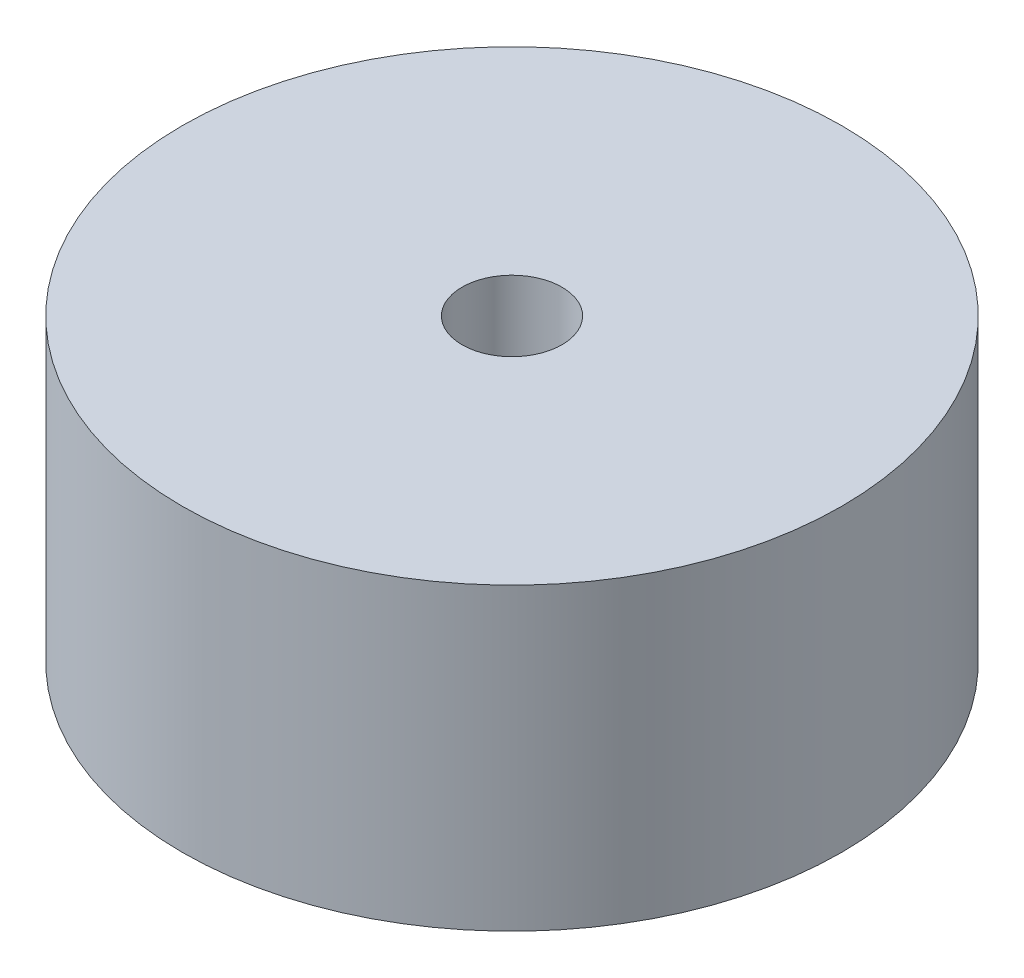
ISO-10303-21;
HEADER;
FILE_DESCRIPTION(('STEP AP214'),'2;1');
FILE_NAME('part.step','',(''),(''),'','','');
FILE_SCHEMA(('AUTOMOTIVE_DESIGN { 1 0 10303 214 1 1 1 1 }'));
ENDSEC;
DATA;
#1=APPLICATION_CONTEXT('core data for automotive mechanical design processes');
#2=APPLICATION_PROTOCOL_DEFINITION('international standard','automotive_design',2000,#1);
#3=PRODUCT_CONTEXT('',#1,'mechanical');
#4=PRODUCT('Part','Part','',(#3));
#5=PRODUCT_RELATED_PRODUCT_CATEGORY('part','',(#4));
#6=PRODUCT_DEFINITION_FORMATION('','',#4);
#7=PRODUCT_DEFINITION_CONTEXT('part definition',#1,'design');
#8=PRODUCT_DEFINITION('design','',#6,#7);
#9=PRODUCT_DEFINITION_SHAPE('','',#8);
#10=(LENGTH_UNIT() NAMED_UNIT(*) SI_UNIT(.MILLI.,.METRE.));
#11=(NAMED_UNIT(*) PLANE_ANGLE_UNIT() SI_UNIT($,.RADIAN.));
#12=(NAMED_UNIT(*) SI_UNIT($,.STERADIAN.) SOLID_ANGLE_UNIT());
#13=UNCERTAINTY_MEASURE_WITH_UNIT(LENGTH_MEASURE(1.E-05),#10,'distance_accuracy_value','');
#14=(GEOMETRIC_REPRESENTATION_CONTEXT(3) GLOBAL_UNCERTAINTY_ASSIGNED_CONTEXT((#13)) GLOBAL_UNIT_ASSIGNED_CONTEXT((#10,
#11,#12)) REPRESENTATION_CONTEXT('',''));
#15=CARTESIAN_POINT('',(0.,0.,0.));
#16=DIRECTION('',(0.,0.,1.));
#17=DIRECTION('',(1.,0.,0.));
#18=AXIS2_PLACEMENT_3D('',#15,#16,#17);
#19=CARTESIAN_POINT('',(0.,30.,0.));
#20=DIRECTION('',(0.,1.,0.));
#21=DIRECTION('',(0.,0.,1.));
#22=AXIS2_PLACEMENT_3D('',#19,#20,#21);
#23=PLANE('',#22);
#24=CARTESIAN_POINT('',(0.,30.,0.));
#25=DIRECTION('',(0.,1.,0.));
#26=DIRECTION('',(0.,0.,1.));
#27=AXIS2_PLACEMENT_3D('',#24,#25,#26);
#28=CIRCLE('',#27,33.);
#29=CARTESIAN_POINT('',(0.,30.,33.));
#30=VERTEX_POINT('',#29);
#31=EDGE_CURVE('E10',#30,#30,#28,.T.);
#32=ORIENTED_EDGE('',*,*,#31,.T.);
#33=EDGE_LOOP('',(#32));
#34=FACE_BOUND('',#33,.T.);
#35=CARTESIAN_POINT('',(0.,30.,0.));
#36=DIRECTION('',(0.,1.,0.));
#37=DIRECTION('',(0.,0.,1.));
#38=AXIS2_PLACEMENT_3D('',#35,#36,#37);
#39=CIRCLE('',#38,5.);
#40=CARTESIAN_POINT('',(0.,30.,5.));
#41=VERTEX_POINT('',#40);
#42=EDGE_CURVE('E42',#41,#41,#39,.T.);
#43=ORIENTED_EDGE('',*,*,#42,.F.);
#44=EDGE_LOOP('',(#43));
#45=FACE_BOUND('',#44,.T.);
#46=ADVANCED_FACE('F31',(#34,#45),#23,.T.);
#47=CARTESIAN_POINT('',(0.,0.,0.));
#48=DIRECTION('',(0.,1.,0.));
#49=DIRECTION('',(0.,0.,1.));
#50=AXIS2_PLACEMENT_3D('',#47,#48,#49);
#51=PLANE('',#50);
#52=CARTESIAN_POINT('',(0.,0.,0.));
#53=DIRECTION('',(0.,1.,0.));
#54=DIRECTION('',(0.,0.,1.));
#55=AXIS2_PLACEMENT_3D('',#52,#53,#54);
#56=CIRCLE('',#55,33.);
#57=CARTESIAN_POINT('',(0.,0.,33.));
#58=VERTEX_POINT('',#57);
#59=EDGE_CURVE('E35',#58,#58,#56,.T.);
#60=ORIENTED_EDGE('',*,*,#59,.F.);
#61=EDGE_LOOP('',(#60));
#62=FACE_BOUND('',#61,.T.);
#63=CARTESIAN_POINT('',(0.,0.,0.));
#64=DIRECTION('',(0.,1.,0.));
#65=DIRECTION('',(0.,0.,1.));
#66=AXIS2_PLACEMENT_3D('',#63,#64,#65);
#67=CIRCLE('',#66,5.);
#68=CARTESIAN_POINT('',(0.,0.,5.));
#69=VERTEX_POINT('',#68);
#70=EDGE_CURVE('E44',#69,#69,#67,.T.);
#71=ORIENTED_EDGE('',*,*,#70,.T.);
#72=EDGE_LOOP('',(#71));
#73=FACE_BOUND('',#72,.T.);
#74=ADVANCED_FACE('F54',(#62,#73),#51,.F.);
#75=CARTESIAN_POINT('',(0.,30.,0.));
#76=DIRECTION('',(0.,-1.,0.));
#77=DIRECTION('',(0.,0.,-1.));
#78=AXIS2_PLACEMENT_3D('',#75,#76,#77);
#79=CYLINDRICAL_SURFACE('',#78,33.);
#80=ORIENTED_EDGE('',*,*,#31,.F.);
#81=EDGE_LOOP('',(#80));
#82=FACE_BOUND('',#81,.T.);
#83=ORIENTED_EDGE('',*,*,#59,.T.);
#84=EDGE_LOOP('',(#83));
#85=FACE_BOUND('',#84,.T.);
#86=ADVANCED_FACE('F33',(#82,#85),#79,.T.);
#87=CARTESIAN_POINT('',(0.,30.,0.));
#88=DIRECTION('',(0.,-1.,0.));
#89=DIRECTION('',(0.,0.,-1.));
#90=AXIS2_PLACEMENT_3D('',#87,#88,#89);
#91=CYLINDRICAL_SURFACE('',#90,5.);
#92=ORIENTED_EDGE('',*,*,#42,.T.);
#93=EDGE_LOOP('',(#92));
#94=FACE_BOUND('',#93,.T.);
#95=ORIENTED_EDGE('',*,*,#70,.F.);
#96=EDGE_LOOP('',(#95));
#97=FACE_BOUND('',#96,.T.);
#98=ADVANCED_FACE('F50',(#94,#97),#91,.F.);
#99=CLOSED_SHELL('',(#46,#74,#86,#98));
#100=MANIFOLD_SOLID_BREP('B2',#99);
#101=ADVANCED_BREP_SHAPE_REPRESENTATION('',(#18,#100),#14);
#102=SHAPE_DEFINITION_REPRESENTATION(#9,#101);
ENDSEC;
END-ISO-10303-21;
